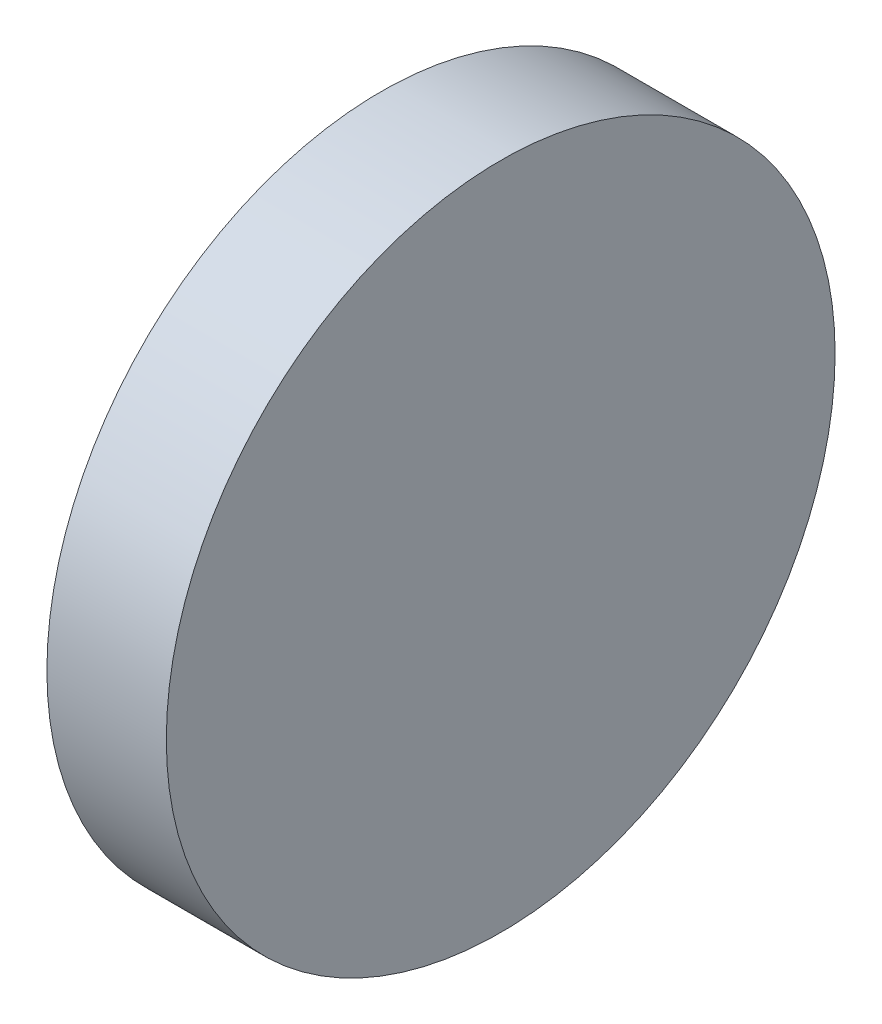
ISO-10303-21;
HEADER;
FILE_DESCRIPTION(('STEP AP214'),'2;1');
FILE_NAME('part.step','',(''),(''),'','','');
FILE_SCHEMA(('AUTOMOTIVE_DESIGN { 1 0 10303 214 1 1 1 1 }'));
ENDSEC;
DATA;
#1=APPLICATION_CONTEXT('core data for automotive mechanical design processes');
#2=APPLICATION_PROTOCOL_DEFINITION('international standard','automotive_design',2000,#1);
#3=PRODUCT_CONTEXT('',#1,'mechanical');
#4=PRODUCT('Part','Part','',(#3));
#5=PRODUCT_RELATED_PRODUCT_CATEGORY('part','',(#4));
#6=PRODUCT_DEFINITION_FORMATION('','',#4);
#7=PRODUCT_DEFINITION_CONTEXT('part definition',#1,'design');
#8=PRODUCT_DEFINITION('design','',#6,#7);
#9=PRODUCT_DEFINITION_SHAPE('','',#8);
#10=(LENGTH_UNIT() NAMED_UNIT(*) SI_UNIT(.MILLI.,.METRE.));
#11=(NAMED_UNIT(*) PLANE_ANGLE_UNIT() SI_UNIT($,.RADIAN.));
#12=(NAMED_UNIT(*) SI_UNIT($,.STERADIAN.) SOLID_ANGLE_UNIT());
#13=UNCERTAINTY_MEASURE_WITH_UNIT(LENGTH_MEASURE(1.E-05),#10,'distance_accuracy_value','');
#14=(GEOMETRIC_REPRESENTATION_CONTEXT(3) GLOBAL_UNCERTAINTY_ASSIGNED_CONTEXT((#13)) GLOBAL_UNIT_ASSIGNED_CONTEXT((#10,
#11,#12)) REPRESENTATION_CONTEXT('',''));
#15=CARTESIAN_POINT('',(0.,0.,0.));
#16=DIRECTION('',(0.,0.,1.));
#17=DIRECTION('',(1.,0.,0.));
#18=AXIS2_PLACEMENT_3D('',#15,#16,#17);
#19=CARTESIAN_POINT('',(2.5,0.,0.));
#20=DIRECTION('',(-1.,0.,0.));
#21=DIRECTION('',(0.,0.,1.));
#22=AXIS2_PLACEMENT_3D('',#19,#20,#21);
#23=CYLINDRICAL_SURFACE('',#22,7.);
#24=CARTESIAN_POINT('',(2.5,0.,0.));
#25=DIRECTION('',(1.,0.,0.));
#26=DIRECTION('',(0.,0.,-1.));
#27=AXIS2_PLACEMENT_3D('',#24,#25,#26);
#28=CIRCLE('',#27,7.);
#29=CARTESIAN_POINT('',(2.5,0.,-7.));
#30=VERTEX_POINT('',#29);
#31=EDGE_CURVE('E10',#30,#30,#28,.T.);
#32=ORIENTED_EDGE('',*,*,#31,.F.);
#33=EDGE_LOOP('',(#32));
#34=FACE_BOUND('',#33,.T.);
#35=CARTESIAN_POINT('',(0.,0.,0.));
#36=DIRECTION('',(1.,0.,0.));
#37=DIRECTION('',(0.,0.,-1.));
#38=AXIS2_PLACEMENT_3D('',#35,#36,#37);
#39=CIRCLE('',#38,7.);
#40=CARTESIAN_POINT('',(0.,0.,-7.));
#41=VERTEX_POINT('',#40);
#42=EDGE_CURVE('E34',#41,#41,#39,.T.);
#43=ORIENTED_EDGE('',*,*,#42,.T.);
#44=EDGE_LOOP('',(#43));
#45=FACE_BOUND('',#44,.T.);
#46=ADVANCED_FACE('F31',(#34,#45),#23,.T.);
#47=CARTESIAN_POINT('',(2.5,0.,0.));
#48=DIRECTION('',(1.,0.,0.));
#49=DIRECTION('',(0.,0.,-1.));
#50=AXIS2_PLACEMENT_3D('',#47,#48,#49);
#51=PLANE('',#50);
#52=ORIENTED_EDGE('',*,*,#31,.T.);
#53=EDGE_LOOP('',(#52));
#54=FACE_BOUND('',#53,.T.);
#55=ADVANCED_FACE('F46',(#54),#51,.T.);
#56=CARTESIAN_POINT('',(0.,0.,0.));
#57=DIRECTION('',(1.,0.,0.));
#58=DIRECTION('',(0.,0.,-1.));
#59=AXIS2_PLACEMENT_3D('',#56,#57,#58);
#60=PLANE('',#59);
#61=ORIENTED_EDGE('',*,*,#42,.F.);
#62=EDGE_LOOP('',(#61));
#63=FACE_BOUND('',#62,.T.);
#64=ADVANCED_FACE('F44',(#63),#60,.F.);
#65=CLOSED_SHELL('',(#46,#55,#64));
#66=MANIFOLD_SOLID_BREP('B2',#65);
#67=ADVANCED_BREP_SHAPE_REPRESENTATION('',(#18,#66),#14);
#68=SHAPE_DEFINITION_REPRESENTATION(#9,#67);
ENDSEC;
END-ISO-10303-21;
